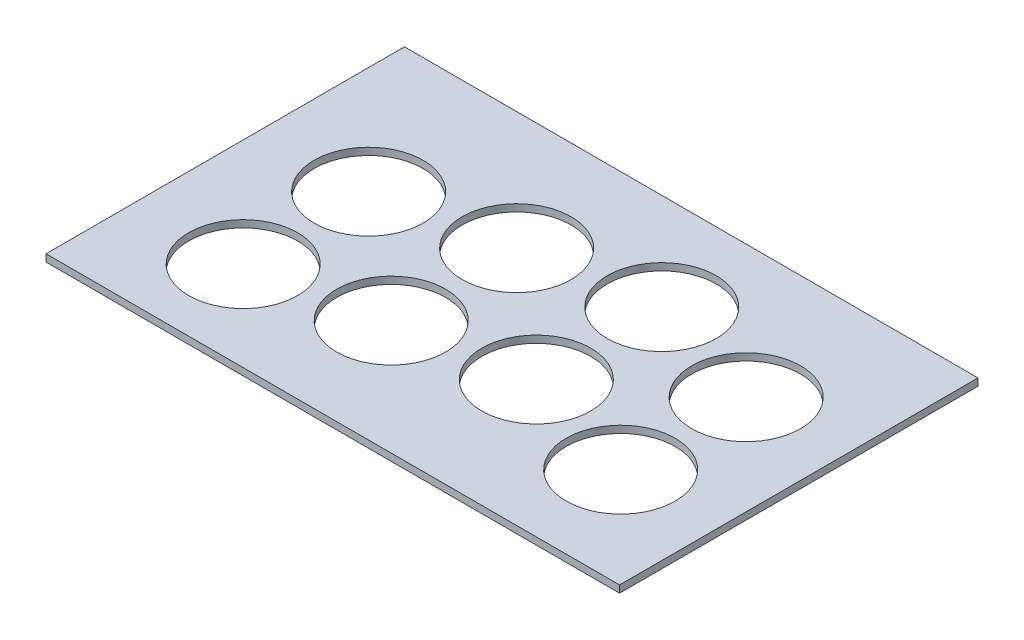
ISO-10303-21;
HEADER;
FILE_DESCRIPTION(('STEP AP214'),'2;1');
FILE_NAME('part.step','',(''),(''),'','','');
FILE_SCHEMA(('AUTOMOTIVE_DESIGN { 1 0 10303 214 1 1 1 1 }'));
ENDSEC;
DATA;
#1=APPLICATION_CONTEXT('core data for automotive mechanical design processes');
#2=APPLICATION_PROTOCOL_DEFINITION('international standard','automotive_design',2000,#1);
#3=PRODUCT_CONTEXT('',#1,'mechanical');
#4=PRODUCT('Part','Part','',(#3));
#5=PRODUCT_RELATED_PRODUCT_CATEGORY('part','',(#4));
#6=PRODUCT_DEFINITION_FORMATION('','',#4);
#7=PRODUCT_DEFINITION_CONTEXT('part definition',#1,'design');
#8=PRODUCT_DEFINITION('design','',#6,#7);
#9=PRODUCT_DEFINITION_SHAPE('','',#8);
#10=(LENGTH_UNIT() NAMED_UNIT(*) SI_UNIT(.MILLI.,.METRE.));
#11=(NAMED_UNIT(*) PLANE_ANGLE_UNIT() SI_UNIT($,.RADIAN.));
#12=(NAMED_UNIT(*) SI_UNIT($,.STERADIAN.) SOLID_ANGLE_UNIT());
#13=UNCERTAINTY_MEASURE_WITH_UNIT(LENGTH_MEASURE(1.E-05),#10,'distance_accuracy_value','');
#14=(GEOMETRIC_REPRESENTATION_CONTEXT(3) GLOBAL_UNCERTAINTY_ASSIGNED_CONTEXT((#13)) GLOBAL_UNIT_ASSIGNED_CONTEXT((#10,
#11,#12)) REPRESENTATION_CONTEXT('',''));
#15=CARTESIAN_POINT('',(0.,0.,0.));
#16=DIRECTION('',(0.,0.,1.));
#17=DIRECTION('',(1.,0.,0.));
#18=AXIS2_PLACEMENT_3D('',#15,#16,#17);
#19=CARTESIAN_POINT('',(0.,2.,0.));
#20=DIRECTION('',(0.,-1.,0.));
#21=DIRECTION('',(0.,0.,-1.));
#22=AXIS2_PLACEMENT_3D('',#19,#20,#21);
#23=PLANE('',#22);
#24=DIRECTION('',(0.,0.,-1.));
#25=VECTOR('',#24,1.);
#26=CARTESIAN_POINT('',(0.,2.,0.));
#27=LINE('',#26,#25);
#28=CARTESIAN_POINT('',(0.,2.,100.));
#29=VERTEX_POINT('',#28);
#30=CARTESIAN_POINT('',(0.,2.,0.));
#31=VERTEX_POINT('',#30);
#32=EDGE_CURVE('E93',#29,#31,#27,.T.);
#33=ORIENTED_EDGE('',*,*,#32,.T.);
#34=DIRECTION('',(-1.,0.,0.));
#35=VECTOR('',#34,1.);
#36=CARTESIAN_POINT('',(0.,2.,0.));
#37=LINE('',#36,#35);
#38=CARTESIAN_POINT('',(-160.,2.,0.));
#39=VERTEX_POINT('',#38);
#40=EDGE_CURVE('E88',#31,#39,#37,.T.);
#41=ORIENTED_EDGE('',*,*,#40,.T.);
#42=DIRECTION('',(0.,0.,1.));
#43=VECTOR('',#42,1.);
#44=CARTESIAN_POINT('',(-160.,2.,0.));
#45=LINE('',#44,#43);
#46=CARTESIAN_POINT('',(-160.,2.,100.));
#47=VERTEX_POINT('',#46);
#48=EDGE_CURVE('E90',#39,#47,#45,.T.);
#49=ORIENTED_EDGE('',*,*,#48,.T.);
#50=DIRECTION('',(1.,0.,0.));
#51=VECTOR('',#50,1.);
#52=CARTESIAN_POINT('',(0.,2.,100.));
#53=LINE('',#52,#51);
#54=EDGE_CURVE('E57',#47,#29,#53,.T.);
#55=ORIENTED_EDGE('',*,*,#54,.T.);
#56=EDGE_LOOP('',(#33,#41,#49,#55));
#57=FACE_BOUND('',#56,.T.);
#58=CARTESIAN_POINT('',(-130.,2.,40.));
#59=DIRECTION('',(0.,1.,0.));
#60=DIRECTION('',(0.,0.,1.));
#61=AXIS2_PLACEMENT_3D('',#58,#59,#60);
#62=CIRCLE('',#61,15.2);
#63=CARTESIAN_POINT('',(-130.,2.,55.2));
#64=VERTEX_POINT('',#63);
#65=EDGE_CURVE('E106',#64,#64,#62,.T.);
#66=ORIENTED_EDGE('',*,*,#65,.F.);
#67=EDGE_LOOP('',(#66));
#68=FACE_BOUND('',#67,.T.);
#69=CARTESIAN_POINT('',(-95.7071436010355,2.,33.));
#70=DIRECTION('',(0.,1.,0.));
#71=DIRECTION('',(0.,0.,1.));
#72=AXIS2_PLACEMENT_3D('',#69,#70,#71);
#73=CIRCLE('',#72,15.2);
#74=CARTESIAN_POINT('',(-95.7071436010355,2.,48.2));
#75=VERTEX_POINT('',#74);
#76=EDGE_CURVE('E121',#75,#75,#73,.T.);
#77=ORIENTED_EDGE('',*,*,#76,.F.);
#78=EDGE_LOOP('',(#77));
#79=FACE_BOUND('',#78,.T.);
#80=CARTESIAN_POINT('',(-61.2252643019022,2.,27.));
#81=DIRECTION('',(0.,1.,0.));
#82=DIRECTION('',(0.,0.,1.));
#83=AXIS2_PLACEMENT_3D('',#80,#81,#82);
#84=CIRCLE('',#83,15.2);
#85=CARTESIAN_POINT('',(-61.2252643019022,2.,42.2));
#86=VERTEX_POINT('',#85);
#87=EDGE_CURVE('E130',#86,#86,#84,.T.);
#88=ORIENTED_EDGE('',*,*,#87,.F.);
#89=EDGE_LOOP('',(#88));
#90=FACE_BOUND('',#89,.T.);
#91=CARTESIAN_POINT('',(-27.6842446394053,2.,37.));
#92=DIRECTION('',(0.,1.,0.));
#93=DIRECTION('',(0.,0.,1.));
#94=AXIS2_PLACEMENT_3D('',#91,#92,#93);
#95=CIRCLE('',#94,15.2);
#96=CARTESIAN_POINT('',(-27.6842446394053,2.,52.2));
#97=VERTEX_POINT('',#96);
#98=EDGE_CURVE('E135',#97,#97,#95,.T.);
#99=ORIENTED_EDGE('',*,*,#98,.F.);
#100=EDGE_LOOP('',(#99));
#101=FACE_BOUND('',#100,.T.);
#102=CARTESIAN_POINT('',(-27.6842446394053,2.,72.));
#103=DIRECTION('',(0.,1.,0.));
#104=DIRECTION('',(0.,0.,1.));
#105=AXIS2_PLACEMENT_3D('',#102,#103,#104);
#106=CIRCLE('',#105,15.2);
#107=CARTESIAN_POINT('',(-27.6842446394053,2.,87.2));
#108=VERTEX_POINT('',#107);
#109=EDGE_CURVE('E138',#108,#108,#106,.T.);
#110=ORIENTED_EDGE('',*,*,#109,.F.);
#111=EDGE_LOOP('',(#110));
#112=FACE_BOUND('',#111,.T.);
#113=CARTESIAN_POINT('',(-61.2252643019022,2.,62.));
#114=DIRECTION('',(0.,1.,0.));
#115=DIRECTION('',(0.,0.,1.));
#116=AXIS2_PLACEMENT_3D('',#113,#114,#115);
#117=CIRCLE('',#116,15.2);
#118=CARTESIAN_POINT('',(-61.2252643019022,2.,77.2));
#119=VERTEX_POINT('',#118);
#120=EDGE_CURVE('E144',#119,#119,#117,.T.);
#121=ORIENTED_EDGE('',*,*,#120,.F.);
#122=EDGE_LOOP('',(#121));
#123=FACE_BOUND('',#122,.T.);
#124=CARTESIAN_POINT('',(-95.7071436010355,2.,68.));
#125=DIRECTION('',(0.,1.,0.));
#126=DIRECTION('',(0.,0.,1.));
#127=AXIS2_PLACEMENT_3D('',#124,#125,#126);
#128=CIRCLE('',#127,15.2);
#129=CARTESIAN_POINT('',(-95.7071436010355,2.,83.2));
#130=VERTEX_POINT('',#129);
#131=EDGE_CURVE('E151',#130,#130,#128,.T.);
#132=ORIENTED_EDGE('',*,*,#131,.F.);
#133=EDGE_LOOP('',(#132));
#134=FACE_BOUND('',#133,.T.);
#135=CARTESIAN_POINT('',(-130.,2.,75.));
#136=DIRECTION('',(0.,1.,0.));
#137=DIRECTION('',(0.,0.,1.));
#138=AXIS2_PLACEMENT_3D('',#135,#136,#137);
#139=CIRCLE('',#138,15.2);
#140=CARTESIAN_POINT('',(-130.,2.,90.2));
#141=VERTEX_POINT('',#140);
#142=EDGE_CURVE('E160',#141,#141,#139,.T.);
#143=ORIENTED_EDGE('',*,*,#142,.F.);
#144=EDGE_LOOP('',(#143));
#145=FACE_BOUND('',#144,.T.);
#146=ADVANCED_FACE('F39',(#57,#68,#79,#90,#101,#112,#123,#134,#145),#23,.F.);
#147=CARTESIAN_POINT('',(0.,0.,0.));
#148=DIRECTION('',(0.,-1.,0.));
#149=DIRECTION('',(0.,0.,-1.));
#150=AXIS2_PLACEMENT_3D('',#147,#148,#149);
#151=PLANE('',#150);
#152=CARTESIAN_POINT('',(-95.7071436010355,0.,68.));
#153=DIRECTION('',(0.,1.,0.));
#154=DIRECTION('',(0.,0.,1.));
#155=AXIS2_PLACEMENT_3D('',#152,#153,#154);
#156=CIRCLE('',#155,15.2);
#157=CARTESIAN_POINT('',(-95.7071436010355,0.,83.2));
#158=VERTEX_POINT('',#157);
#159=EDGE_CURVE('E152',#158,#158,#156,.T.);
#160=ORIENTED_EDGE('',*,*,#159,.T.);
#161=EDGE_LOOP('',(#160));
#162=FACE_BOUND('',#161,.T.);
#163=CARTESIAN_POINT('',(-27.6842446394053,0.,72.));
#164=DIRECTION('',(0.,1.,0.));
#165=DIRECTION('',(0.,0.,1.));
#166=AXIS2_PLACEMENT_3D('',#163,#164,#165);
#167=CIRCLE('',#166,15.2);
#168=CARTESIAN_POINT('',(-27.6842446394053,0.,87.2));
#169=VERTEX_POINT('',#168);
#170=EDGE_CURVE('E142',#169,#169,#167,.T.);
#171=ORIENTED_EDGE('',*,*,#170,.T.);
#172=EDGE_LOOP('',(#171));
#173=FACE_BOUND('',#172,.T.);
#174=CARTESIAN_POINT('',(-61.2252643019022,0.,27.));
#175=DIRECTION('',(0.,1.,0.));
#176=DIRECTION('',(0.,0.,1.));
#177=AXIS2_PLACEMENT_3D('',#174,#175,#176);
#178=CIRCLE('',#177,15.2);
#179=CARTESIAN_POINT('',(-61.2252643019022,0.,42.2));
#180=VERTEX_POINT('',#179);
#181=EDGE_CURVE('E128',#180,#180,#178,.T.);
#182=ORIENTED_EDGE('',*,*,#181,.T.);
#183=EDGE_LOOP('',(#182));
#184=FACE_BOUND('',#183,.T.);
#185=CARTESIAN_POINT('',(-130.,0.,40.));
#186=DIRECTION('',(0.,1.,0.));
#187=DIRECTION('',(0.,0.,1.));
#188=AXIS2_PLACEMENT_3D('',#185,#186,#187);
#189=CIRCLE('',#188,15.2);
#190=CARTESIAN_POINT('',(-130.,0.,55.2));
#191=VERTEX_POINT('',#190);
#192=EDGE_CURVE('E120',#191,#191,#189,.T.);
#193=ORIENTED_EDGE('',*,*,#192,.T.);
#194=EDGE_LOOP('',(#193));
#195=FACE_BOUND('',#194,.T.);
#196=DIRECTION('',(0.,0.,-1.));
#197=VECTOR('',#196,1.);
#198=CARTESIAN_POINT('',(0.,0.,0.));
#199=LINE('',#198,#197);
#200=CARTESIAN_POINT('',(0.,0.,100.));
#201=VERTEX_POINT('',#200);
#202=CARTESIAN_POINT('',(0.,0.,0.));
#203=VERTEX_POINT('',#202);
#204=EDGE_CURVE('E103',#201,#203,#199,.T.);
#205=ORIENTED_EDGE('',*,*,#204,.F.);
#206=DIRECTION('',(1.,0.,0.));
#207=VECTOR('',#206,1.);
#208=CARTESIAN_POINT('',(0.,0.,100.));
#209=LINE('',#208,#207);
#210=CARTESIAN_POINT('',(-160.,0.,100.));
#211=VERTEX_POINT('',#210);
#212=EDGE_CURVE('E78',#211,#201,#209,.T.);
#213=ORIENTED_EDGE('',*,*,#212,.F.);
#214=DIRECTION('',(0.,0.,1.));
#215=VECTOR('',#214,1.);
#216=CARTESIAN_POINT('',(-160.,0.,0.));
#217=LINE('',#216,#215);
#218=CARTESIAN_POINT('',(-160.,0.,0.));
#219=VERTEX_POINT('',#218);
#220=EDGE_CURVE('E71',#219,#211,#217,.T.);
#221=ORIENTED_EDGE('',*,*,#220,.F.);
#222=DIRECTION('',(-1.,0.,0.));
#223=VECTOR('',#222,1.);
#224=CARTESIAN_POINT('',(0.,0.,0.));
#225=LINE('',#224,#223);
#226=EDGE_CURVE('E92',#203,#219,#225,.T.);
#227=ORIENTED_EDGE('',*,*,#226,.F.);
#228=EDGE_LOOP('',(#205,#213,#221,#227));
#229=FACE_BOUND('',#228,.T.);
#230=CARTESIAN_POINT('',(-95.7071436010355,0.,33.));
#231=DIRECTION('',(0.,1.,0.));
#232=DIRECTION('',(0.,0.,1.));
#233=AXIS2_PLACEMENT_3D('',#230,#231,#232);
#234=CIRCLE('',#233,15.2);
#235=CARTESIAN_POINT('',(-95.7071436010355,0.,48.2));
#236=VERTEX_POINT('',#235);
#237=EDGE_CURVE('E123',#236,#236,#234,.T.);
#238=ORIENTED_EDGE('',*,*,#237,.T.);
#239=EDGE_LOOP('',(#238));
#240=FACE_BOUND('',#239,.T.);
#241=CARTESIAN_POINT('',(-27.6842446394053,0.,37.));
#242=DIRECTION('',(0.,1.,0.));
#243=DIRECTION('',(0.,0.,1.));
#244=AXIS2_PLACEMENT_3D('',#241,#242,#243);
#245=CIRCLE('',#244,15.2);
#246=CARTESIAN_POINT('',(-27.6842446394053,0.,52.2));
#247=VERTEX_POINT('',#246);
#248=EDGE_CURVE('E136',#247,#247,#245,.T.);
#249=ORIENTED_EDGE('',*,*,#248,.T.);
#250=EDGE_LOOP('',(#249));
#251=FACE_BOUND('',#250,.T.);
#252=CARTESIAN_POINT('',(-61.2252643019022,0.,62.));
#253=DIRECTION('',(0.,1.,0.));
#254=DIRECTION('',(0.,0.,1.));
#255=AXIS2_PLACEMENT_3D('',#252,#253,#254);
#256=CIRCLE('',#255,15.2);
#257=CARTESIAN_POINT('',(-61.2252643019022,0.,77.2));
#258=VERTEX_POINT('',#257);
#259=EDGE_CURVE('E146',#258,#258,#256,.T.);
#260=ORIENTED_EDGE('',*,*,#259,.T.);
#261=EDGE_LOOP('',(#260));
#262=FACE_BOUND('',#261,.T.);
#263=CARTESIAN_POINT('',(-130.,0.,75.));
#264=DIRECTION('',(0.,1.,0.));
#265=DIRECTION('',(0.,0.,1.));
#266=AXIS2_PLACEMENT_3D('',#263,#264,#265);
#267=CIRCLE('',#266,15.2);
#268=CARTESIAN_POINT('',(-130.,0.,90.2));
#269=VERTEX_POINT('',#268);
#270=EDGE_CURVE('E159',#269,#269,#267,.T.);
#271=ORIENTED_EDGE('',*,*,#270,.T.);
#272=EDGE_LOOP('',(#271));
#273=FACE_BOUND('',#272,.T.);
#274=ADVANCED_FACE('F111',(#162,#173,#184,#195,#229,#240,#251,#262,#273),#151,.T.);
#275=CARTESIAN_POINT('',(0.,2.,0.));
#276=DIRECTION('',(-1.,0.,0.));
#277=DIRECTION('',(0.,0.,1.));
#278=AXIS2_PLACEMENT_3D('',#275,#276,#277);
#279=PLANE('',#278);
#280=ORIENTED_EDGE('',*,*,#204,.T.);
#281=DIRECTION('',(0.,-1.,0.));
#282=VECTOR('',#281,1.);
#283=CARTESIAN_POINT('',(0.,2.,0.));
#284=LINE('',#283,#282);
#285=EDGE_CURVE('E11',#31,#203,#284,.T.);
#286=ORIENTED_EDGE('',*,*,#285,.F.);
#287=ORIENTED_EDGE('',*,*,#32,.F.);
#288=DIRECTION('',(0.,-1.,0.));
#289=VECTOR('',#288,1.);
#290=CARTESIAN_POINT('',(0.,2.,100.));
#291=LINE('',#290,#289);
#292=EDGE_CURVE('E97',#29,#201,#291,.T.);
#293=ORIENTED_EDGE('',*,*,#292,.T.);
#294=EDGE_LOOP('',(#280,#286,#287,#293));
#295=FACE_BOUND('',#294,.T.);
#296=ADVANCED_FACE('F41',(#295),#279,.F.);
#297=CARTESIAN_POINT('',(0.,2.,0.));
#298=DIRECTION('',(0.,0.,1.));
#299=DIRECTION('',(1.,0.,0.));
#300=AXIS2_PLACEMENT_3D('',#297,#298,#299);
#301=PLANE('',#300);
#302=ORIENTED_EDGE('',*,*,#226,.T.);
#303=DIRECTION('',(0.,-1.,0.));
#304=VECTOR('',#303,1.);
#305=CARTESIAN_POINT('',(-160.,2.,0.));
#306=LINE('',#305,#304);
#307=EDGE_CURVE('E48',#39,#219,#306,.T.);
#308=ORIENTED_EDGE('',*,*,#307,.F.);
#309=ORIENTED_EDGE('',*,*,#40,.F.);
#310=ORIENTED_EDGE('',*,*,#285,.T.);
#311=EDGE_LOOP('',(#302,#308,#309,#310));
#312=FACE_BOUND('',#311,.T.);
#313=ADVANCED_FACE('F94',(#312),#301,.F.);
#314=CARTESIAN_POINT('',(-160.,2.,0.));
#315=DIRECTION('',(1.,0.,0.));
#316=DIRECTION('',(0.,0.,-1.));
#317=AXIS2_PLACEMENT_3D('',#314,#315,#316);
#318=PLANE('',#317);
#319=ORIENTED_EDGE('',*,*,#220,.T.);
#320=DIRECTION('',(0.,-1.,0.));
#321=VECTOR('',#320,1.);
#322=CARTESIAN_POINT('',(-160.,2.,100.));
#323=LINE('',#322,#321);
#324=EDGE_CURVE('E96',#47,#211,#323,.T.);
#325=ORIENTED_EDGE('',*,*,#324,.F.);
#326=ORIENTED_EDGE('',*,*,#48,.F.);
#327=ORIENTED_EDGE('',*,*,#307,.T.);
#328=EDGE_LOOP('',(#319,#325,#326,#327));
#329=FACE_BOUND('',#328,.T.);
#330=ADVANCED_FACE('F100',(#329),#318,.F.);
#331=CARTESIAN_POINT('',(0.,2.,100.));
#332=DIRECTION('',(0.,0.,-1.));
#333=DIRECTION('',(-1.,0.,0.));
#334=AXIS2_PLACEMENT_3D('',#331,#332,#333);
#335=PLANE('',#334);
#336=ORIENTED_EDGE('',*,*,#212,.T.);
#337=ORIENTED_EDGE('',*,*,#292,.F.);
#338=ORIENTED_EDGE('',*,*,#54,.F.);
#339=ORIENTED_EDGE('',*,*,#324,.T.);
#340=EDGE_LOOP('',(#336,#337,#338,#339));
#341=FACE_BOUND('',#340,.T.);
#342=ADVANCED_FACE('F112',(#341),#335,.F.);
#343=CARTESIAN_POINT('',(-130.,2.,40.));
#344=DIRECTION('',(0.,-1.,0.));
#345=DIRECTION('',(0.,0.,-1.));
#346=AXIS2_PLACEMENT_3D('',#343,#344,#345);
#347=CYLINDRICAL_SURFACE('',#346,15.2);
#348=ORIENTED_EDGE('',*,*,#65,.T.);
#349=EDGE_LOOP('',(#348));
#350=FACE_BOUND('',#349,.T.);
#351=ORIENTED_EDGE('',*,*,#192,.F.);
#352=EDGE_LOOP('',(#351));
#353=FACE_BOUND('',#352,.T.);
#354=ADVANCED_FACE('F177',(#350,#353),#347,.F.);
#355=CARTESIAN_POINT('',(-95.7071436010355,2.,33.));
#356=DIRECTION('',(0.,-1.,0.));
#357=DIRECTION('',(0.,0.,-1.));
#358=AXIS2_PLACEMENT_3D('',#355,#356,#357);
#359=CYLINDRICAL_SURFACE('',#358,15.2);
#360=ORIENTED_EDGE('',*,*,#76,.T.);
#361=EDGE_LOOP('',(#360));
#362=FACE_BOUND('',#361,.T.);
#363=ORIENTED_EDGE('',*,*,#237,.F.);
#364=EDGE_LOOP('',(#363));
#365=FACE_BOUND('',#364,.T.);
#366=ADVANCED_FACE('F225',(#362,#365),#359,.F.);
#367=CARTESIAN_POINT('',(-61.2252643019022,2.,27.));
#368=DIRECTION('',(0.,-1.,0.));
#369=DIRECTION('',(0.,0.,-1.));
#370=AXIS2_PLACEMENT_3D('',#367,#368,#369);
#371=CYLINDRICAL_SURFACE('',#370,15.2);
#372=ORIENTED_EDGE('',*,*,#87,.T.);
#373=EDGE_LOOP('',(#372));
#374=FACE_BOUND('',#373,.T.);
#375=ORIENTED_EDGE('',*,*,#181,.F.);
#376=EDGE_LOOP('',(#375));
#377=FACE_BOUND('',#376,.T.);
#378=ADVANCED_FACE('F227',(#374,#377),#371,.F.);
#379=CARTESIAN_POINT('',(-27.6842446394053,2.,37.));
#380=DIRECTION('',(0.,-1.,0.));
#381=DIRECTION('',(0.,0.,-1.));
#382=AXIS2_PLACEMENT_3D('',#379,#380,#381);
#383=CYLINDRICAL_SURFACE('',#382,15.2);
#384=ORIENTED_EDGE('',*,*,#98,.T.);
#385=EDGE_LOOP('',(#384));
#386=FACE_BOUND('',#385,.T.);
#387=ORIENTED_EDGE('',*,*,#248,.F.);
#388=EDGE_LOOP('',(#387));
#389=FACE_BOUND('',#388,.T.);
#390=ADVANCED_FACE('F236',(#386,#389),#383,.F.);
#391=CARTESIAN_POINT('',(-27.6842446394053,2.,72.));
#392=DIRECTION('',(0.,-1.,0.));
#393=DIRECTION('',(0.,0.,-1.));
#394=AXIS2_PLACEMENT_3D('',#391,#392,#393);
#395=CYLINDRICAL_SURFACE('',#394,15.2);
#396=ORIENTED_EDGE('',*,*,#109,.T.);
#397=EDGE_LOOP('',(#396));
#398=FACE_BOUND('',#397,.T.);
#399=ORIENTED_EDGE('',*,*,#170,.F.);
#400=EDGE_LOOP('',(#399));
#401=FACE_BOUND('',#400,.T.);
#402=ADVANCED_FACE('F247',(#398,#401),#395,.F.);
#403=CARTESIAN_POINT('',(-61.2252643019022,2.,62.));
#404=DIRECTION('',(0.,-1.,0.));
#405=DIRECTION('',(0.,0.,-1.));
#406=AXIS2_PLACEMENT_3D('',#403,#404,#405);
#407=CYLINDRICAL_SURFACE('',#406,15.2);
#408=ORIENTED_EDGE('',*,*,#120,.T.);
#409=EDGE_LOOP('',(#408));
#410=FACE_BOUND('',#409,.T.);
#411=ORIENTED_EDGE('',*,*,#259,.F.);
#412=EDGE_LOOP('',(#411));
#413=FACE_BOUND('',#412,.T.);
#414=ADVANCED_FACE('F258',(#410,#413),#407,.F.);
#415=CARTESIAN_POINT('',(-95.7071436010355,2.,68.));
#416=DIRECTION('',(0.,-1.,0.));
#417=DIRECTION('',(0.,0.,-1.));
#418=AXIS2_PLACEMENT_3D('',#415,#416,#417);
#419=CYLINDRICAL_SURFACE('',#418,15.2);
#420=ORIENTED_EDGE('',*,*,#131,.T.);
#421=EDGE_LOOP('',(#420));
#422=FACE_BOUND('',#421,.T.);
#423=ORIENTED_EDGE('',*,*,#159,.F.);
#424=EDGE_LOOP('',(#423));
#425=FACE_BOUND('',#424,.T.);
#426=ADVANCED_FACE('F264',(#422,#425),#419,.F.);
#427=CARTESIAN_POINT('',(-130.,2.,75.));
#428=DIRECTION('',(0.,-1.,0.));
#429=DIRECTION('',(0.,0.,-1.));
#430=AXIS2_PLACEMENT_3D('',#427,#428,#429);
#431=CYLINDRICAL_SURFACE('',#430,15.2);
#432=ORIENTED_EDGE('',*,*,#142,.T.);
#433=EDGE_LOOP('',(#432));
#434=FACE_BOUND('',#433,.T.);
#435=ORIENTED_EDGE('',*,*,#270,.F.);
#436=EDGE_LOOP('',(#435));
#437=FACE_BOUND('',#436,.T.);
#438=ADVANCED_FACE('F167',(#434,#437),#431,.F.);
#439=CLOSED_SHELL('',(#146,#274,#296,#313,#330,#342,#354,#366,#378,#390,#402,#414,#426,#438));
#440=MANIFOLD_SOLID_BREP('B2',#439);
#441=ADVANCED_BREP_SHAPE_REPRESENTATION('',(#18,#440),#14);
#442=SHAPE_DEFINITION_REPRESENTATION(#9,#441);
ENDSEC;
END-ISO-10303-21;
